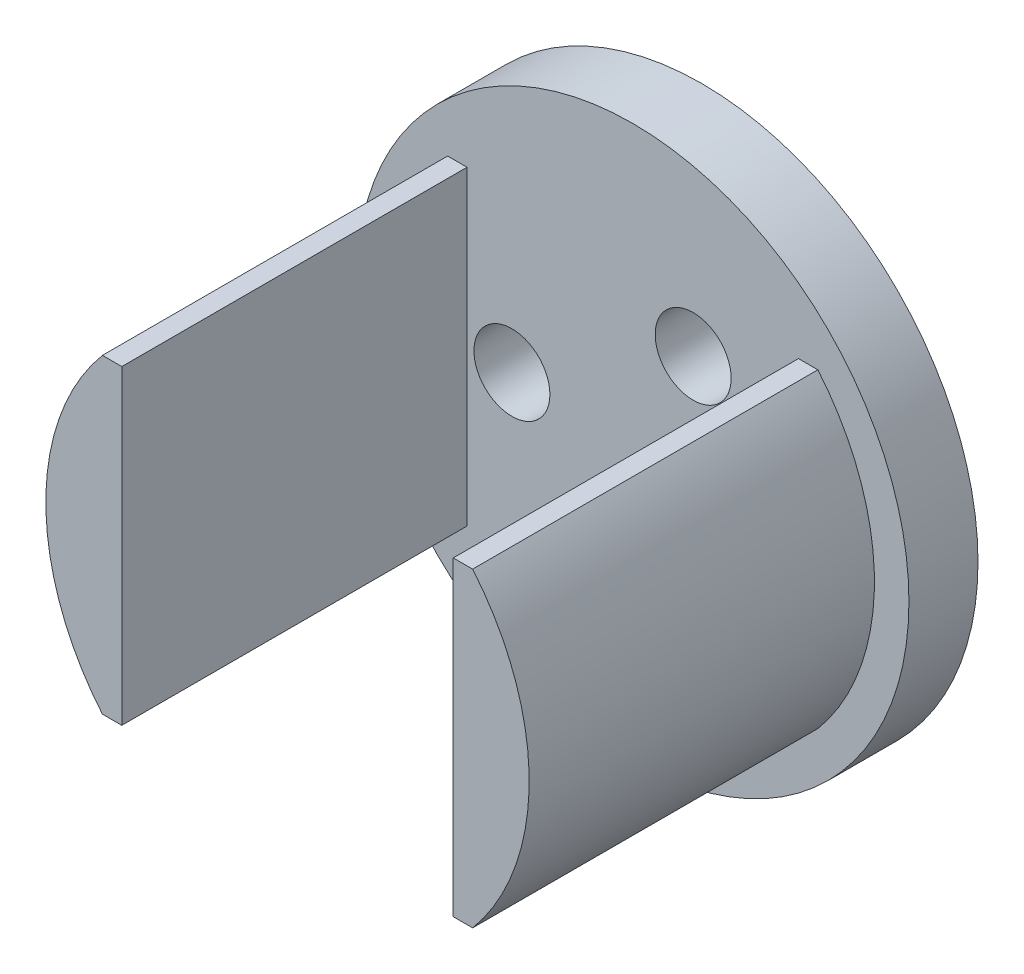
ISO-10303-21;
HEADER;
FILE_DESCRIPTION(('STEP AP214'),'2;1');
FILE_NAME('part.step','',(''),(''),'','','');
FILE_SCHEMA(('AUTOMOTIVE_DESIGN { 1 0 10303 214 1 1 1 1 }'));
ENDSEC;
DATA;
#1=APPLICATION_CONTEXT('core data for automotive mechanical design processes');
#2=APPLICATION_PROTOCOL_DEFINITION('international standard','automotive_design',2000,#1);
#3=PRODUCT_CONTEXT('',#1,'mechanical');
#4=PRODUCT('Part','Part','',(#3));
#5=PRODUCT_RELATED_PRODUCT_CATEGORY('part','',(#4));
#6=PRODUCT_DEFINITION_FORMATION('','',#4);
#7=PRODUCT_DEFINITION_CONTEXT('part definition',#1,'design');
#8=PRODUCT_DEFINITION('design','',#6,#7);
#9=PRODUCT_DEFINITION_SHAPE('','',#8);
#10=(LENGTH_UNIT() NAMED_UNIT(*) SI_UNIT(.MILLI.,.METRE.));
#11=(NAMED_UNIT(*) PLANE_ANGLE_UNIT() SI_UNIT($,.RADIAN.));
#12=(NAMED_UNIT(*) SI_UNIT($,.STERADIAN.) SOLID_ANGLE_UNIT());
#13=UNCERTAINTY_MEASURE_WITH_UNIT(LENGTH_MEASURE(1.E-05),#10,'distance_accuracy_value','');
#14=(GEOMETRIC_REPRESENTATION_CONTEXT(3) GLOBAL_UNCERTAINTY_ASSIGNED_CONTEXT((#13)) GLOBAL_UNIT_ASSIGNED_CONTEXT((#10,
#11,#12)) REPRESENTATION_CONTEXT('',''));
#15=CARTESIAN_POINT('',(0.,0.,0.));
#16=DIRECTION('',(0.,0.,1.));
#17=DIRECTION('',(1.,0.,0.));
#18=AXIS2_PLACEMENT_3D('',#15,#16,#17);
#19=CARTESIAN_POINT('',(0.,0.,2.));
#20=DIRECTION('',(0.,0.,1.));
#21=DIRECTION('',(1.,0.,0.));
#22=AXIS2_PLACEMENT_3D('',#19,#20,#21);
#23=PLANE('',#22);
#24=DIRECTION('',(1.,0.,0.));
#25=VECTOR('',#24,1.);
#26=CARTESIAN_POINT('',(0.,4.5,2.));
#27=LINE('',#26,#25);
#28=CARTESIAN_POINT('',(-5.36190264738181,4.5,2.));
#29=VERTEX_POINT('',#28);
#30=CARTESIAN_POINT('',(-4.8,4.5,2.));
#31=VERTEX_POINT('',#30);
#32=EDGE_CURVE('E123',#29,#31,#27,.T.);
#33=ORIENTED_EDGE('',*,*,#32,.T.);
#34=DIRECTION('',(0.,1.,0.));
#35=VECTOR('',#34,1.);
#36=CARTESIAN_POINT('',(-4.8,0.,2.));
#37=LINE('',#36,#35);
#38=CARTESIAN_POINT('',(-4.8,-4.5,2.));
#39=VERTEX_POINT('',#38);
#40=EDGE_CURVE('E136',#39,#31,#37,.T.);
#41=ORIENTED_EDGE('',*,*,#40,.F.);
#42=DIRECTION('',(1.,0.,0.));
#43=VECTOR('',#42,1.);
#44=CARTESIAN_POINT('',(0.,-4.5,2.));
#45=LINE('',#44,#43);
#46=CARTESIAN_POINT('',(-5.36190264738181,-4.5,2.));
#47=VERTEX_POINT('',#46);
#48=EDGE_CURVE('E144',#47,#39,#45,.T.);
#49=ORIENTED_EDGE('',*,*,#48,.F.);
#50=CARTESIAN_POINT('',(0.,0.,2.));
#51=DIRECTION('',(0.,0.,1.));
#52=DIRECTION('',(1.,0.,0.));
#53=AXIS2_PLACEMENT_3D('',#50,#51,#52);
#54=CIRCLE('',#53,7.);
#55=EDGE_CURVE('E126',#29,#47,#54,.T.);
#56=ORIENTED_EDGE('',*,*,#55,.F.);
#57=EDGE_LOOP('',(#33,#41,#49,#56));
#58=FACE_BOUND('',#57,.T.);
#59=CARTESIAN_POINT('',(1.75,-3.03108891324553,2.));
#60=DIRECTION('',(0.,0.,1.));
#61=DIRECTION('',(1.,0.,0.));
#62=AXIS2_PLACEMENT_3D('',#59,#60,#61);
#63=CIRCLE('',#62,1.1);
#64=CARTESIAN_POINT('',(2.85,-3.03108891324553,2.));
#65=VERTEX_POINT('',#64);
#66=EDGE_CURVE('E158',#65,#65,#63,.T.);
#67=ORIENTED_EDGE('',*,*,#66,.F.);
#68=EDGE_LOOP('',(#67));
#69=FACE_BOUND('',#68,.T.);
#70=CARTESIAN_POINT('',(-3.5,0.,2.));
#71=DIRECTION('',(0.,0.,1.));
#72=DIRECTION('',(1.,0.,0.));
#73=AXIS2_PLACEMENT_3D('',#70,#71,#72);
#74=CIRCLE('',#73,1.1);
#75=CARTESIAN_POINT('',(-2.4,0.,2.));
#76=VERTEX_POINT('',#75);
#77=EDGE_CURVE('E161',#76,#76,#74,.T.);
#78=ORIENTED_EDGE('',*,*,#77,.F.);
#79=EDGE_LOOP('',(#78));
#80=FACE_BOUND('',#79,.T.);
#81=CARTESIAN_POINT('',(1.75,3.03108891324554,2.));
#82=DIRECTION('',(0.,0.,1.));
#83=DIRECTION('',(1.,0.,0.));
#84=AXIS2_PLACEMENT_3D('',#81,#82,#83);
#85=CIRCLE('',#84,1.1);
#86=CARTESIAN_POINT('',(2.85,3.03108891324554,2.));
#87=VERTEX_POINT('',#86);
#88=EDGE_CURVE('E43',#87,#87,#85,.T.);
#89=ORIENTED_EDGE('',*,*,#88,.F.);
#90=EDGE_LOOP('',(#89));
#91=FACE_BOUND('',#90,.T.);
#92=CARTESIAN_POINT('',(0.,0.,2.));
#93=DIRECTION('',(0.,0.,1.));
#94=DIRECTION('',(1.,0.,0.));
#95=AXIS2_PLACEMENT_3D('',#92,#93,#94);
#96=CIRCLE('',#95,8.);
#97=CARTESIAN_POINT('',(8.,0.,2.));
#98=VERTEX_POINT('',#97);
#99=EDGE_CURVE('E11',#98,#98,#96,.T.);
#100=ORIENTED_EDGE('',*,*,#99,.T.);
#101=EDGE_LOOP('',(#100));
#102=FACE_BOUND('',#101,.T.);
#103=CARTESIAN_POINT('',(0.,0.,2.));
#104=DIRECTION('',(0.,0.,1.));
#105=DIRECTION('',(1.,0.,0.));
#106=AXIS2_PLACEMENT_3D('',#103,#104,#105);
#107=CIRCLE('',#106,7.);
#108=CARTESIAN_POINT('',(5.3619026473818,-4.5,2.));
#109=VERTEX_POINT('',#108);
#110=CARTESIAN_POINT('',(5.36190264738181,4.5,2.));
#111=VERTEX_POINT('',#110);
#112=EDGE_CURVE('E51',#109,#111,#107,.T.);
#113=ORIENTED_EDGE('',*,*,#112,.F.);
#114=DIRECTION('',(1.,0.,0.));
#115=VECTOR('',#114,1.);
#116=CARTESIAN_POINT('',(0.,-4.5,2.));
#117=LINE('',#116,#115);
#118=CARTESIAN_POINT('',(4.8,-4.5,2.));
#119=VERTEX_POINT('',#118);
#120=EDGE_CURVE('E122',#119,#109,#117,.T.);
#121=ORIENTED_EDGE('',*,*,#120,.F.);
#122=DIRECTION('',(0.,1.,0.));
#123=VECTOR('',#122,1.);
#124=CARTESIAN_POINT('',(4.8,0.,2.));
#125=LINE('',#124,#123);
#126=CARTESIAN_POINT('',(4.8,4.5,2.));
#127=VERTEX_POINT('',#126);
#128=EDGE_CURVE('E119',#119,#127,#125,.T.);
#129=ORIENTED_EDGE('',*,*,#128,.T.);
#130=DIRECTION('',(1.,0.,0.));
#131=VECTOR('',#130,1.);
#132=CARTESIAN_POINT('',(0.,4.5,2.));
#133=LINE('',#132,#131);
#134=EDGE_CURVE('E56',#127,#111,#133,.T.);
#135=ORIENTED_EDGE('',*,*,#134,.T.);
#136=EDGE_LOOP('',(#113,#121,#129,#135));
#137=FACE_BOUND('',#136,.T.);
#138=ADVANCED_FACE('F34',(#58,#69,#80,#91,#102,#137),#23,.T.);
#139=CARTESIAN_POINT('',(1.75,3.03108891324554,2.));
#140=DIRECTION('',(0.,0.,-1.));
#141=DIRECTION('',(-1.,0.,0.));
#142=AXIS2_PLACEMENT_3D('',#139,#140,#141);
#143=CYLINDRICAL_SURFACE('',#142,1.1);
#144=ORIENTED_EDGE('',*,*,#88,.T.);
#145=EDGE_LOOP('',(#144));
#146=FACE_BOUND('',#145,.T.);
#147=CARTESIAN_POINT('',(1.75,3.03108891324554,0.));
#148=DIRECTION('',(0.,0.,1.));
#149=DIRECTION('',(1.,0.,0.));
#150=AXIS2_PLACEMENT_3D('',#147,#148,#149);
#151=CIRCLE('',#150,1.1);
#152=CARTESIAN_POINT('',(2.85,3.03108891324554,0.));
#153=VERTEX_POINT('',#152);
#154=EDGE_CURVE('E170',#153,#153,#151,.T.);
#155=ORIENTED_EDGE('',*,*,#154,.F.);
#156=EDGE_LOOP('',(#155));
#157=FACE_BOUND('',#156,.T.);
#158=ADVANCED_FACE('F196',(#146,#157),#143,.F.);
#159=CARTESIAN_POINT('',(-3.5,0.,2.));
#160=DIRECTION('',(0.,0.,-1.));
#161=DIRECTION('',(-1.,0.,0.));
#162=AXIS2_PLACEMENT_3D('',#159,#160,#161);
#163=CYLINDRICAL_SURFACE('',#162,1.1);
#164=ORIENTED_EDGE('',*,*,#77,.T.);
#165=EDGE_LOOP('',(#164));
#166=FACE_BOUND('',#165,.T.);
#167=CARTESIAN_POINT('',(-3.5,0.,0.));
#168=DIRECTION('',(0.,0.,1.));
#169=DIRECTION('',(1.,0.,0.));
#170=AXIS2_PLACEMENT_3D('',#167,#168,#169);
#171=CIRCLE('',#170,1.1);
#172=CARTESIAN_POINT('',(-2.4,0.,0.));
#173=VERTEX_POINT('',#172);
#174=EDGE_CURVE('E168',#173,#173,#171,.T.);
#175=ORIENTED_EDGE('',*,*,#174,.F.);
#176=EDGE_LOOP('',(#175));
#177=FACE_BOUND('',#176,.T.);
#178=ADVANCED_FACE('F201',(#166,#177),#163,.F.);
#179=CARTESIAN_POINT('',(1.75,-3.03108891324553,2.));
#180=DIRECTION('',(0.,0.,-1.));
#181=DIRECTION('',(-1.,0.,0.));
#182=AXIS2_PLACEMENT_3D('',#179,#180,#181);
#183=CYLINDRICAL_SURFACE('',#182,1.1);
#184=ORIENTED_EDGE('',*,*,#66,.T.);
#185=EDGE_LOOP('',(#184));
#186=FACE_BOUND('',#185,.T.);
#187=CARTESIAN_POINT('',(1.75,-3.03108891324553,0.));
#188=DIRECTION('',(0.,0.,1.));
#189=DIRECTION('',(1.,0.,0.));
#190=AXIS2_PLACEMENT_3D('',#187,#188,#189);
#191=CIRCLE('',#190,1.1);
#192=CARTESIAN_POINT('',(2.85,-3.03108891324553,0.));
#193=VERTEX_POINT('',#192);
#194=EDGE_CURVE('E157',#193,#193,#191,.T.);
#195=ORIENTED_EDGE('',*,*,#194,.F.);
#196=EDGE_LOOP('',(#195));
#197=FACE_BOUND('',#196,.T.);
#198=ADVANCED_FACE('F36',(#186,#197),#183,.F.);
#199=CARTESIAN_POINT('',(0.,0.,2.));
#200=DIRECTION('',(0.,0.,-1.));
#201=DIRECTION('',(-1.,0.,0.));
#202=AXIS2_PLACEMENT_3D('',#199,#200,#201);
#203=CYLINDRICAL_SURFACE('',#202,8.);
#204=ORIENTED_EDGE('',*,*,#99,.F.);
#205=EDGE_LOOP('',(#204));
#206=FACE_BOUND('',#205,.T.);
#207=CARTESIAN_POINT('',(0.,0.,0.));
#208=DIRECTION('',(0.,0.,1.));
#209=DIRECTION('',(1.,0.,0.));
#210=AXIS2_PLACEMENT_3D('',#207,#208,#209);
#211=CIRCLE('',#210,8.);
#212=CARTESIAN_POINT('',(8.,0.,0.));
#213=VERTEX_POINT('',#212);
#214=EDGE_CURVE('E38',#213,#213,#211,.T.);
#215=ORIENTED_EDGE('',*,*,#214,.T.);
#216=EDGE_LOOP('',(#215));
#217=FACE_BOUND('',#216,.T.);
#218=ADVANCED_FACE('F177',(#206,#217),#203,.T.);
#219=CARTESIAN_POINT('',(0.,0.,0.));
#220=DIRECTION('',(0.,0.,1.));
#221=DIRECTION('',(1.,0.,0.));
#222=AXIS2_PLACEMENT_3D('',#219,#220,#221);
#223=PLANE('',#222);
#224=ORIENTED_EDGE('',*,*,#194,.T.);
#225=EDGE_LOOP('',(#224));
#226=FACE_BOUND('',#225,.T.);
#227=ORIENTED_EDGE('',*,*,#174,.T.);
#228=EDGE_LOOP('',(#227));
#229=FACE_BOUND('',#228,.T.);
#230=ORIENTED_EDGE('',*,*,#154,.T.);
#231=EDGE_LOOP('',(#230));
#232=FACE_BOUND('',#231,.T.);
#233=ORIENTED_EDGE('',*,*,#214,.F.);
#234=EDGE_LOOP('',(#233));
#235=FACE_BOUND('',#234,.T.);
#236=ADVANCED_FACE('F179',(#226,#229,#232,#235),#223,.F.);
#237=CARTESIAN_POINT('',(0.,4.5,12.));
#238=DIRECTION('',(0.,1.,0.));
#239=DIRECTION('',(0.,0.,1.));
#240=AXIS2_PLACEMENT_3D('',#237,#238,#239);
#241=PLANE('',#240);
#242=ORIENTED_EDGE('',*,*,#32,.F.);
#243=DIRECTION('',(0.,0.,-1.));
#244=VECTOR('',#243,1.);
#245=CARTESIAN_POINT('',(-5.36190264738181,4.5,12.));
#246=LINE('',#245,#244);
#247=CARTESIAN_POINT('',(-5.36190264738181,4.5,12.));
#248=VERTEX_POINT('',#247);
#249=EDGE_CURVE('E155',#248,#29,#246,.T.);
#250=ORIENTED_EDGE('',*,*,#249,.F.);
#251=DIRECTION('',(1.,0.,0.));
#252=VECTOR('',#251,1.);
#253=CARTESIAN_POINT('',(0.,4.5,12.));
#254=LINE('',#253,#252);
#255=CARTESIAN_POINT('',(-4.8,4.5,12.));
#256=VERTEX_POINT('',#255);
#257=EDGE_CURVE('E132',#248,#256,#254,.T.);
#258=ORIENTED_EDGE('',*,*,#257,.T.);
#259=DIRECTION('',(0.,0.,-1.));
#260=VECTOR('',#259,1.);
#261=CARTESIAN_POINT('',(-4.8,4.5,12.));
#262=LINE('',#261,#260);
#263=EDGE_CURVE('E141',#256,#31,#262,.T.);
#264=ORIENTED_EDGE('',*,*,#263,.T.);
#265=EDGE_LOOP('',(#242,#250,#258,#264));
#266=FACE_BOUND('',#265,.T.);
#267=ADVANCED_FACE('F181',(#266),#241,.T.);
#268=CARTESIAN_POINT('',(0.,0.,12.));
#269=DIRECTION('',(0.,0.,-1.));
#270=DIRECTION('',(-1.,0.,0.));
#271=AXIS2_PLACEMENT_3D('',#268,#269,#270);
#272=CYLINDRICAL_SURFACE('',#271,7.);
#273=ORIENTED_EDGE('',*,*,#55,.T.);
#274=DIRECTION('',(0.,0.,-1.));
#275=VECTOR('',#274,1.);
#276=CARTESIAN_POINT('',(-5.36190264738181,-4.5,12.));
#277=LINE('',#276,#275);
#278=CARTESIAN_POINT('',(-5.36190264738181,-4.5,12.));
#279=VERTEX_POINT('',#278);
#280=EDGE_CURVE('E152',#279,#47,#277,.T.);
#281=ORIENTED_EDGE('',*,*,#280,.F.);
#282=CARTESIAN_POINT('',(0.,0.,12.));
#283=DIRECTION('',(0.,0.,1.));
#284=DIRECTION('',(1.,0.,0.));
#285=AXIS2_PLACEMENT_3D('',#282,#283,#284);
#286=CIRCLE('',#285,7.);
#287=EDGE_CURVE('E135',#248,#279,#286,.T.);
#288=ORIENTED_EDGE('',*,*,#287,.F.);
#289=ORIENTED_EDGE('',*,*,#249,.T.);
#290=EDGE_LOOP('',(#273,#281,#288,#289));
#291=FACE_BOUND('',#290,.T.);
#292=ADVANCED_FACE('F188',(#291),#272,.T.);
#293=CARTESIAN_POINT('',(0.,-4.5,12.));
#294=DIRECTION('',(0.,1.,0.));
#295=DIRECTION('',(0.,0.,1.));
#296=AXIS2_PLACEMENT_3D('',#293,#294,#295);
#297=PLANE('',#296);
#298=ORIENTED_EDGE('',*,*,#48,.T.);
#299=DIRECTION('',(0.,0.,-1.));
#300=VECTOR('',#299,1.);
#301=CARTESIAN_POINT('',(-4.8,-4.5,12.));
#302=LINE('',#301,#300);
#303=CARTESIAN_POINT('',(-4.8,-4.5,12.));
#304=VERTEX_POINT('',#303);
#305=EDGE_CURVE('E150',#304,#39,#302,.T.);
#306=ORIENTED_EDGE('',*,*,#305,.F.);
#307=DIRECTION('',(1.,0.,0.));
#308=VECTOR('',#307,1.);
#309=CARTESIAN_POINT('',(0.,-4.5,12.));
#310=LINE('',#309,#308);
#311=EDGE_CURVE('E138',#279,#304,#310,.T.);
#312=ORIENTED_EDGE('',*,*,#311,.F.);
#313=ORIENTED_EDGE('',*,*,#280,.T.);
#314=EDGE_LOOP('',(#298,#306,#312,#313));
#315=FACE_BOUND('',#314,.T.);
#316=ADVANCED_FACE('F208',(#315),#297,.F.);
#317=CARTESIAN_POINT('',(-4.8,0.,12.));
#318=DIRECTION('',(-1.,0.,0.));
#319=DIRECTION('',(0.,-1.,0.));
#320=AXIS2_PLACEMENT_3D('',#317,#318,#319);
#321=PLANE('',#320);
#322=ORIENTED_EDGE('',*,*,#40,.T.);
#323=ORIENTED_EDGE('',*,*,#263,.F.);
#324=DIRECTION('',(0.,1.,0.));
#325=VECTOR('',#324,1.);
#326=CARTESIAN_POINT('',(-4.8,0.,12.));
#327=LINE('',#326,#325);
#328=EDGE_CURVE('E140',#304,#256,#327,.T.);
#329=ORIENTED_EDGE('',*,*,#328,.F.);
#330=ORIENTED_EDGE('',*,*,#305,.T.);
#331=EDGE_LOOP('',(#322,#323,#329,#330));
#332=FACE_BOUND('',#331,.T.);
#333=ADVANCED_FACE('F212',(#332),#321,.F.);
#334=CARTESIAN_POINT('',(0.,0.,12.));
#335=DIRECTION('',(0.,0.,1.));
#336=DIRECTION('',(1.,0.,0.));
#337=AXIS2_PLACEMENT_3D('',#334,#335,#336);
#338=PLANE('',#337);
#339=ORIENTED_EDGE('',*,*,#257,.F.);
#340=ORIENTED_EDGE('',*,*,#287,.T.);
#341=ORIENTED_EDGE('',*,*,#311,.T.);
#342=ORIENTED_EDGE('',*,*,#328,.T.);
#343=EDGE_LOOP('',(#339,#340,#341,#342));
#344=FACE_BOUND('',#343,.T.);
#345=ADVANCED_FACE('F216',(#344),#338,.T.);
#346=CARTESIAN_POINT('',(0.,-4.5,12.));
#347=DIRECTION('',(0.,1.,0.));
#348=DIRECTION('',(0.,0.,1.));
#349=AXIS2_PLACEMENT_3D('',#346,#347,#348);
#350=PLANE('',#349);
#351=ORIENTED_EDGE('',*,*,#120,.T.);
#352=DIRECTION('',(0.,0.,-1.));
#353=VECTOR('',#352,1.);
#354=CARTESIAN_POINT('',(5.36190264738181,-4.5,12.));
#355=LINE('',#354,#353);
#356=CARTESIAN_POINT('',(5.36190264738181,-4.5,12.));
#357=VERTEX_POINT('',#356);
#358=EDGE_CURVE('E103',#357,#109,#355,.T.);
#359=ORIENTED_EDGE('',*,*,#358,.F.);
#360=DIRECTION('',(1.,0.,0.));
#361=VECTOR('',#360,1.);
#362=CARTESIAN_POINT('',(0.,-4.5,12.));
#363=LINE('',#362,#361);
#364=CARTESIAN_POINT('',(4.8,-4.5,12.));
#365=VERTEX_POINT('',#364);
#366=EDGE_CURVE('E110',#365,#357,#363,.T.);
#367=ORIENTED_EDGE('',*,*,#366,.F.);
#368=DIRECTION('',(0.,0.,-1.));
#369=VECTOR('',#368,1.);
#370=CARTESIAN_POINT('',(4.8,-4.5,12.));
#371=LINE('',#370,#369);
#372=EDGE_CURVE('E350',#365,#119,#371,.T.);
#373=ORIENTED_EDGE('',*,*,#372,.T.);
#374=EDGE_LOOP('',(#351,#359,#367,#373));
#375=FACE_BOUND('',#374,.T.);
#376=ADVANCED_FACE('F121',(#375),#350,.F.);
#377=CARTESIAN_POINT('',(0.,0.,12.));
#378=DIRECTION('',(0.,0.,-1.));
#379=DIRECTION('',(-1.,0.,0.));
#380=AXIS2_PLACEMENT_3D('',#377,#378,#379);
#381=CYLINDRICAL_SURFACE('',#380,7.);
#382=ORIENTED_EDGE('',*,*,#112,.T.);
#383=DIRECTION('',(0.,0.,-1.));
#384=VECTOR('',#383,1.);
#385=CARTESIAN_POINT('',(5.36190264738181,4.5,12.));
#386=LINE('',#385,#384);
#387=CARTESIAN_POINT('',(5.36190264738181,4.5,12.));
#388=VERTEX_POINT('',#387);
#389=EDGE_CURVE('E105',#388,#111,#386,.T.);
#390=ORIENTED_EDGE('',*,*,#389,.F.);
#391=CARTESIAN_POINT('',(0.,0.,12.));
#392=DIRECTION('',(0.,0.,1.));
#393=DIRECTION('',(1.,0.,0.));
#394=AXIS2_PLACEMENT_3D('',#391,#392,#393);
#395=CIRCLE('',#394,7.);
#396=EDGE_CURVE('E99',#357,#388,#395,.T.);
#397=ORIENTED_EDGE('',*,*,#396,.F.);
#398=ORIENTED_EDGE('',*,*,#358,.T.);
#399=EDGE_LOOP('',(#382,#390,#397,#398));
#400=FACE_BOUND('',#399,.T.);
#401=ADVANCED_FACE('F101',(#400),#381,.T.);
#402=CARTESIAN_POINT('',(0.,4.5,12.));
#403=DIRECTION('',(0.,1.,0.));
#404=DIRECTION('',(0.,0.,1.));
#405=AXIS2_PLACEMENT_3D('',#402,#403,#404);
#406=PLANE('',#405);
#407=ORIENTED_EDGE('',*,*,#134,.F.);
#408=DIRECTION('',(0.,0.,-1.));
#409=VECTOR('',#408,1.);
#410=CARTESIAN_POINT('',(4.8,4.5,12.));
#411=LINE('',#410,#409);
#412=CARTESIAN_POINT('',(4.8,4.5,12.));
#413=VERTEX_POINT('',#412);
#414=EDGE_CURVE('E128',#413,#127,#411,.T.);
#415=ORIENTED_EDGE('',*,*,#414,.F.);
#416=DIRECTION('',(1.,0.,0.));
#417=VECTOR('',#416,1.);
#418=CARTESIAN_POINT('',(0.,4.5,12.));
#419=LINE('',#418,#417);
#420=EDGE_CURVE('E109',#413,#388,#419,.T.);
#421=ORIENTED_EDGE('',*,*,#420,.T.);
#422=ORIENTED_EDGE('',*,*,#389,.T.);
#423=EDGE_LOOP('',(#407,#415,#421,#422));
#424=FACE_BOUND('',#423,.T.);
#425=ADVANCED_FACE('F225',(#424),#406,.T.);
#426=CARTESIAN_POINT('',(4.8,0.,12.));
#427=DIRECTION('',(-1.,0.,0.));
#428=DIRECTION('',(0.,-1.,0.));
#429=AXIS2_PLACEMENT_3D('',#426,#427,#428);
#430=PLANE('',#429);
#431=ORIENTED_EDGE('',*,*,#128,.F.);
#432=ORIENTED_EDGE('',*,*,#372,.F.);
#433=DIRECTION('',(0.,1.,0.));
#434=VECTOR('',#433,1.);
#435=CARTESIAN_POINT('',(4.8,0.,12.));
#436=LINE('',#435,#434);
#437=EDGE_CURVE('E116',#365,#413,#436,.T.);
#438=ORIENTED_EDGE('',*,*,#437,.T.);
#439=ORIENTED_EDGE('',*,*,#414,.T.);
#440=EDGE_LOOP('',(#431,#432,#438,#439));
#441=FACE_BOUND('',#440,.T.);
#442=ADVANCED_FACE('F228',(#441),#430,.T.);
#443=CARTESIAN_POINT('',(0.,0.,12.));
#444=DIRECTION('',(0.,0.,1.));
#445=DIRECTION('',(1.,0.,0.));
#446=AXIS2_PLACEMENT_3D('',#443,#444,#445);
#447=PLANE('',#446);
#448=ORIENTED_EDGE('',*,*,#366,.T.);
#449=ORIENTED_EDGE('',*,*,#396,.T.);
#450=ORIENTED_EDGE('',*,*,#420,.F.);
#451=ORIENTED_EDGE('',*,*,#437,.F.);
#452=EDGE_LOOP('',(#448,#449,#450,#451));
#453=FACE_BOUND('',#452,.T.);
#454=ADVANCED_FACE('F114',(#453),#447,.T.);
#455=CLOSED_SHELL('',(#138,#158,#178,#198,#218,#236,#267,#292,#316,#333,#345,#376,#401,#425,
#442,#454));
#456=MANIFOLD_SOLID_BREP('B2',#455);
#457=ADVANCED_BREP_SHAPE_REPRESENTATION('',(#18,#456),#14);
#458=SHAPE_DEFINITION_REPRESENTATION(#9,#457);
ENDSEC;
END-ISO-10303-21;
